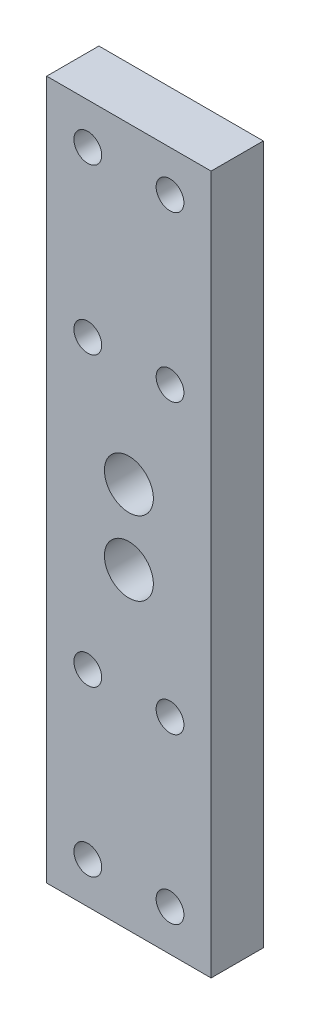
ISO-10303-21;
HEADER;
FILE_DESCRIPTION(('STEP AP214'),'2;1');
FILE_NAME('part.step','',(''),(''),'','','');
FILE_SCHEMA(('AUTOMOTIVE_DESIGN { 1 0 10303 214 1 1 1 1 }'));
ENDSEC;
DATA;
#1=APPLICATION_CONTEXT('core data for automotive mechanical design processes');
#2=APPLICATION_PROTOCOL_DEFINITION('international standard','automotive_design',2000,#1);
#3=PRODUCT_CONTEXT('',#1,'mechanical');
#4=PRODUCT('Part','Part','',(#3));
#5=PRODUCT_RELATED_PRODUCT_CATEGORY('part','',(#4));
#6=PRODUCT_DEFINITION_FORMATION('','',#4);
#7=PRODUCT_DEFINITION_CONTEXT('part definition',#1,'design');
#8=PRODUCT_DEFINITION('design','',#6,#7);
#9=PRODUCT_DEFINITION_SHAPE('','',#8);
#10=(LENGTH_UNIT() NAMED_UNIT(*) SI_UNIT(.MILLI.,.METRE.));
#11=(NAMED_UNIT(*) PLANE_ANGLE_UNIT() SI_UNIT($,.RADIAN.));
#12=(NAMED_UNIT(*) SI_UNIT($,.STERADIAN.) SOLID_ANGLE_UNIT());
#13=UNCERTAINTY_MEASURE_WITH_UNIT(LENGTH_MEASURE(1.E-05),#10,'distance_accuracy_value','');
#14=(GEOMETRIC_REPRESENTATION_CONTEXT(3) GLOBAL_UNCERTAINTY_ASSIGNED_CONTEXT((#13)) GLOBAL_UNIT_ASSIGNED_CONTEXT((#10,
#11,#12)) REPRESENTATION_CONTEXT('',''));
#15=CARTESIAN_POINT('',(0.,0.,0.));
#16=DIRECTION('',(0.,0.,1.));
#17=DIRECTION('',(1.,0.,0.));
#18=AXIS2_PLACEMENT_3D('',#15,#16,#17);
#19=CARTESIAN_POINT('',(-20.,85.,6.35));
#20=DIRECTION('',(1.,0.,0.));
#21=DIRECTION('',(0.,1.,0.));
#22=AXIS2_PLACEMENT_3D('',#19,#20,#21);
#23=PLANE('',#22);
#24=DIRECTION('',(0.,-1.,0.));
#25=VECTOR('',#24,1.);
#26=CARTESIAN_POINT('',(-20.,85.,-6.35));
#27=LINE('',#26,#25);
#28=CARTESIAN_POINT('',(-20.,85.,-6.35));
#29=VERTEX_POINT('',#28);
#30=CARTESIAN_POINT('',(-20.,-85.,-6.35));
#31=VERTEX_POINT('',#30);
#32=EDGE_CURVE('E96',#29,#31,#27,.T.);
#33=ORIENTED_EDGE('',*,*,#32,.T.);
#34=DIRECTION('',(0.,0.,-1.));
#35=VECTOR('',#34,1.);
#36=CARTESIAN_POINT('',(-20.,-85.,6.35));
#37=LINE('',#36,#35);
#38=CARTESIAN_POINT('',(-20.,-85.,6.35));
#39=VERTEX_POINT('',#38);
#40=EDGE_CURVE('E11',#39,#31,#37,.T.);
#41=ORIENTED_EDGE('',*,*,#40,.F.);
#42=DIRECTION('',(0.,-1.,0.));
#43=VECTOR('',#42,1.);
#44=CARTESIAN_POINT('',(-20.,85.,6.35));
#45=LINE('',#44,#43);
#46=CARTESIAN_POINT('',(-20.,85.,6.35));
#47=VERTEX_POINT('',#46);
#48=EDGE_CURVE('E84',#47,#39,#45,.T.);
#49=ORIENTED_EDGE('',*,*,#48,.F.);
#50=DIRECTION('',(0.,0.,-1.));
#51=VECTOR('',#50,1.);
#52=CARTESIAN_POINT('',(-20.,85.,6.35));
#53=LINE('',#52,#51);
#54=EDGE_CURVE('E92',#47,#29,#53,.T.);
#55=ORIENTED_EDGE('',*,*,#54,.T.);
#56=EDGE_LOOP('',(#33,#41,#49,#55));
#57=FACE_BOUND('',#56,.T.);
#58=ADVANCED_FACE('F33',(#57),#23,.F.);
#59=CARTESIAN_POINT('',(20.,-85.,6.35));
#60=DIRECTION('',(0.,1.,0.));
#61=DIRECTION('',(-1.,0.,0.));
#62=AXIS2_PLACEMENT_3D('',#59,#60,#61);
#63=PLANE('',#62);
#64=DIRECTION('',(1.,0.,0.));
#65=VECTOR('',#64,1.);
#66=CARTESIAN_POINT('',(20.,-85.,-6.35));
#67=LINE('',#66,#65);
#68=CARTESIAN_POINT('',(20.,-85.,-6.35));
#69=VERTEX_POINT('',#68);
#70=EDGE_CURVE('E88',#31,#69,#67,.T.);
#71=ORIENTED_EDGE('',*,*,#70,.T.);
#72=DIRECTION('',(0.,0.,-1.));
#73=VECTOR('',#72,1.);
#74=CARTESIAN_POINT('',(20.,-85.,6.35));
#75=LINE('',#74,#73);
#76=CARTESIAN_POINT('',(20.,-85.,6.35));
#77=VERTEX_POINT('',#76);
#78=EDGE_CURVE('E41',#77,#69,#75,.T.);
#79=ORIENTED_EDGE('',*,*,#78,.F.);
#80=DIRECTION('',(1.,0.,0.));
#81=VECTOR('',#80,1.);
#82=CARTESIAN_POINT('',(20.,-85.,6.35));
#83=LINE('',#82,#81);
#84=EDGE_CURVE('E79',#39,#77,#83,.T.);
#85=ORIENTED_EDGE('',*,*,#84,.F.);
#86=ORIENTED_EDGE('',*,*,#40,.T.);
#87=EDGE_LOOP('',(#71,#79,#85,#86));
#88=FACE_BOUND('',#87,.T.);
#89=ADVANCED_FACE('F87',(#88),#63,.F.);
#90=CARTESIAN_POINT('',(20.,85.,6.35));
#91=DIRECTION('',(-1.,0.,0.));
#92=DIRECTION('',(0.,-1.,0.));
#93=AXIS2_PLACEMENT_3D('',#90,#91,#92);
#94=PLANE('',#93);
#95=DIRECTION('',(0.,1.,0.));
#96=VECTOR('',#95,1.);
#97=CARTESIAN_POINT('',(20.,85.,-6.35));
#98=LINE('',#97,#96);
#99=CARTESIAN_POINT('',(20.,85.,-6.35));
#100=VERTEX_POINT('',#99);
#101=EDGE_CURVE('E66',#69,#100,#98,.T.);
#102=ORIENTED_EDGE('',*,*,#101,.T.);
#103=DIRECTION('',(0.,0.,-1.));
#104=VECTOR('',#103,1.);
#105=CARTESIAN_POINT('',(20.,85.,6.35));
#106=LINE('',#105,#104);
#107=CARTESIAN_POINT('',(20.,85.,6.35));
#108=VERTEX_POINT('',#107);
#109=EDGE_CURVE('E89',#108,#100,#106,.T.);
#110=ORIENTED_EDGE('',*,*,#109,.F.);
#111=DIRECTION('',(0.,1.,0.));
#112=VECTOR('',#111,1.);
#113=CARTESIAN_POINT('',(20.,85.,6.35));
#114=LINE('',#113,#112);
#115=EDGE_CURVE('E82',#77,#108,#114,.T.);
#116=ORIENTED_EDGE('',*,*,#115,.F.);
#117=ORIENTED_EDGE('',*,*,#78,.T.);
#118=EDGE_LOOP('',(#102,#110,#116,#117));
#119=FACE_BOUND('',#118,.T.);
#120=ADVANCED_FACE('F90',(#119),#94,.F.);
#121=CARTESIAN_POINT('',(20.,85.,6.35));
#122=DIRECTION('',(0.,-1.,0.));
#123=DIRECTION('',(1.,0.,0.));
#124=AXIS2_PLACEMENT_3D('',#121,#122,#123);
#125=PLANE('',#124);
#126=DIRECTION('',(-1.,0.,0.));
#127=VECTOR('',#126,1.);
#128=CARTESIAN_POINT('',(20.,85.,-6.35));
#129=LINE('',#128,#127);
#130=EDGE_CURVE('E72',#100,#29,#129,.T.);
#131=ORIENTED_EDGE('',*,*,#130,.T.);
#132=ORIENTED_EDGE('',*,*,#54,.F.);
#133=DIRECTION('',(-1.,0.,0.));
#134=VECTOR('',#133,1.);
#135=CARTESIAN_POINT('',(20.,85.,6.35));
#136=LINE('',#135,#134);
#137=EDGE_CURVE('E49',#108,#47,#136,.T.);
#138=ORIENTED_EDGE('',*,*,#137,.F.);
#139=ORIENTED_EDGE('',*,*,#109,.T.);
#140=EDGE_LOOP('',(#131,#132,#138,#139));
#141=FACE_BOUND('',#140,.T.);
#142=ADVANCED_FACE('F104',(#141),#125,.F.);
#143=CARTESIAN_POINT('',(0.,0.,6.35));
#144=DIRECTION('',(0.,0.,-1.));
#145=DIRECTION('',(-1.,0.,0.));
#146=AXIS2_PLACEMENT_3D('',#143,#144,#145);
#147=PLANE('',#146);
#148=CARTESIAN_POINT('',(1.51826910486956E-12,-8.99999999999994,6.35));
#149=DIRECTION('',(0.,0.,-1.));
#150=DIRECTION('',(-1.,0.,0.));
#151=AXIS2_PLACEMENT_3D('',#148,#149,#150);
#152=CIRCLE('',#151,5.95248999999999);
#153=CARTESIAN_POINT('',(-5.95248999999848,-8.99999999999994,6.35));
#154=VERTEX_POINT('',#153);
#155=EDGE_CURVE('E163',#154,#154,#152,.T.);
#156=ORIENTED_EDGE('',*,*,#155,.T.);
#157=EDGE_LOOP('',(#156));
#158=FACE_BOUND('',#157,.T.);
#159=CARTESIAN_POINT('',(1.52047347006448E-12,9.00000000000006,6.35));
#160=DIRECTION('',(0.,0.,-1.));
#161=DIRECTION('',(-1.,0.,0.));
#162=AXIS2_PLACEMENT_3D('',#159,#160,#161);
#163=CIRCLE('',#162,5.95248999999999);
#164=CARTESIAN_POINT('',(-5.95248999999847,9.00000000000006,6.35));
#165=VERTEX_POINT('',#164);
#166=EDGE_CURVE('E157',#165,#165,#163,.T.);
#167=ORIENTED_EDGE('',*,*,#166,.T.);
#168=EDGE_LOOP('',(#167));
#169=FACE_BOUND('',#168,.T.);
#170=CARTESIAN_POINT('',(9.99999999999999,75.,6.35));
#171=DIRECTION('',(0.,0.,1.));
#172=DIRECTION('',(1.,0.,0.));
#173=AXIS2_PLACEMENT_3D('',#170,#171,#172);
#174=CIRCLE('',#173,3.37819999999999);
#175=CARTESIAN_POINT('',(13.3782,75.,6.35));
#176=VERTEX_POINT('',#175);
#177=EDGE_CURVE('E154',#176,#176,#174,.T.);
#178=ORIENTED_EDGE('',*,*,#177,.F.);
#179=EDGE_LOOP('',(#178));
#180=FACE_BOUND('',#179,.T.);
#181=CARTESIAN_POINT('',(10.,35.,6.35));
#182=DIRECTION('',(0.,0.,1.));
#183=DIRECTION('',(1.,0.,0.));
#184=AXIS2_PLACEMENT_3D('',#181,#182,#183);
#185=CIRCLE('',#184,3.37819999999999);
#186=CARTESIAN_POINT('',(13.3782,35.,6.35));
#187=VERTEX_POINT('',#186);
#188=EDGE_CURVE('E148',#187,#187,#185,.T.);
#189=ORIENTED_EDGE('',*,*,#188,.F.);
#190=EDGE_LOOP('',(#189));
#191=FACE_BOUND('',#190,.T.);
#192=CARTESIAN_POINT('',(-10.,35.,6.35));
#193=DIRECTION('',(0.,0.,1.));
#194=DIRECTION('',(1.,0.,0.));
#195=AXIS2_PLACEMENT_3D('',#192,#193,#194);
#196=CIRCLE('',#195,3.37819999999999);
#197=CARTESIAN_POINT('',(-6.62180000000001,35.,6.35));
#198=VERTEX_POINT('',#197);
#199=EDGE_CURVE('E142',#198,#198,#196,.T.);
#200=ORIENTED_EDGE('',*,*,#199,.F.);
#201=EDGE_LOOP('',(#200));
#202=FACE_BOUND('',#201,.T.);
#203=CARTESIAN_POINT('',(-9.99999999999999,75.,6.35));
#204=DIRECTION('',(0.,0.,1.));
#205=DIRECTION('',(1.,0.,0.));
#206=AXIS2_PLACEMENT_3D('',#203,#204,#205);
#207=CIRCLE('',#206,3.37819999999999);
#208=CARTESIAN_POINT('',(-6.62180000000001,75.,6.35));
#209=VERTEX_POINT('',#208);
#210=EDGE_CURVE('E136',#209,#209,#207,.T.);
#211=ORIENTED_EDGE('',*,*,#210,.F.);
#212=EDGE_LOOP('',(#211));
#213=FACE_BOUND('',#212,.T.);
#214=CARTESIAN_POINT('',(-9.99999999999997,-75.,6.35));
#215=DIRECTION('',(0.,0.,1.));
#216=DIRECTION('',(1.,0.,0.));
#217=AXIS2_PLACEMENT_3D('',#214,#215,#216);
#218=CIRCLE('',#217,3.37819999999999);
#219=CARTESIAN_POINT('',(-6.62179999999999,-75.,6.35));
#220=VERTEX_POINT('',#219);
#221=EDGE_CURVE('E130',#220,#220,#218,.T.);
#222=ORIENTED_EDGE('',*,*,#221,.F.);
#223=EDGE_LOOP('',(#222));
#224=FACE_BOUND('',#223,.T.);
#225=CARTESIAN_POINT('',(-9.99999999999999,-35.,6.35));
#226=DIRECTION('',(0.,0.,1.));
#227=DIRECTION('',(1.,0.,0.));
#228=AXIS2_PLACEMENT_3D('',#225,#226,#227);
#229=CIRCLE('',#228,3.37819999999999);
#230=CARTESIAN_POINT('',(-6.6218,-35.,6.35));
#231=VERTEX_POINT('',#230);
#232=EDGE_CURVE('E124',#231,#231,#229,.T.);
#233=ORIENTED_EDGE('',*,*,#232,.F.);
#234=EDGE_LOOP('',(#233));
#235=FACE_BOUND('',#234,.T.);
#236=CARTESIAN_POINT('',(10.,-35.,6.35));
#237=DIRECTION('',(0.,0.,1.));
#238=DIRECTION('',(1.,0.,0.));
#239=AXIS2_PLACEMENT_3D('',#236,#237,#238);
#240=CIRCLE('',#239,3.37819999999999);
#241=CARTESIAN_POINT('',(13.3782,-35.,6.35));
#242=VERTEX_POINT('',#241);
#243=EDGE_CURVE('E118',#242,#242,#240,.T.);
#244=ORIENTED_EDGE('',*,*,#243,.F.);
#245=EDGE_LOOP('',(#244));
#246=FACE_BOUND('',#245,.T.);
#247=CARTESIAN_POINT('',(10.,-75.,6.35));
#248=DIRECTION('',(0.,0.,1.));
#249=DIRECTION('',(1.,0.,0.));
#250=AXIS2_PLACEMENT_3D('',#247,#248,#249);
#251=CIRCLE('',#250,3.37819999999999);
#252=CARTESIAN_POINT('',(13.3782,-75.,6.35));
#253=VERTEX_POINT('',#252);
#254=EDGE_CURVE('E112',#253,#253,#251,.T.);
#255=ORIENTED_EDGE('',*,*,#254,.F.);
#256=EDGE_LOOP('',(#255));
#257=FACE_BOUND('',#256,.T.);
#258=ORIENTED_EDGE('',*,*,#48,.T.);
#259=ORIENTED_EDGE('',*,*,#84,.T.);
#260=ORIENTED_EDGE('',*,*,#115,.T.);
#261=ORIENTED_EDGE('',*,*,#137,.T.);
#262=EDGE_LOOP('',(#258,#259,#260,#261));
#263=FACE_BOUND('',#262,.T.);
#264=ADVANCED_FACE('F80',(#158,#169,#180,#191,#202,#213,#224,#235,#246,#257,#263),#147,.F.);
#265=CARTESIAN_POINT('',(0.,0.,-6.35));
#266=DIRECTION('',(0.,0.,-1.));
#267=DIRECTION('',(-1.,0.,0.));
#268=AXIS2_PLACEMENT_3D('',#265,#266,#267);
#269=PLANE('',#268);
#270=CARTESIAN_POINT('',(1.51826910486956E-12,-8.99999999999994,-6.35));
#271=DIRECTION('',(0.,0.,-1.));
#272=DIRECTION('',(-1.,0.,0.));
#273=AXIS2_PLACEMENT_3D('',#270,#271,#272);
#274=CIRCLE('',#273,5.95248999999999);
#275=CARTESIAN_POINT('',(-5.95248999999847,-8.99999999999994,-6.35));
#276=VERTEX_POINT('',#275);
#277=EDGE_CURVE('E166',#276,#276,#274,.T.);
#278=ORIENTED_EDGE('',*,*,#277,.F.);
#279=EDGE_LOOP('',(#278));
#280=FACE_BOUND('',#279,.T.);
#281=CARTESIAN_POINT('',(1.52047347006448E-12,9.00000000000006,-6.35));
#282=DIRECTION('',(0.,0.,-1.));
#283=DIRECTION('',(-1.,0.,0.));
#284=AXIS2_PLACEMENT_3D('',#281,#282,#283);
#285=CIRCLE('',#284,5.95248999999999);
#286=CARTESIAN_POINT('',(-5.95248999999847,9.00000000000006,-6.35));
#287=VERTEX_POINT('',#286);
#288=EDGE_CURVE('E160',#287,#287,#285,.T.);
#289=ORIENTED_EDGE('',*,*,#288,.F.);
#290=EDGE_LOOP('',(#289));
#291=FACE_BOUND('',#290,.T.);
#292=CARTESIAN_POINT('',(9.99999999999999,75.,-6.35));
#293=DIRECTION('',(0.,0.,1.));
#294=DIRECTION('',(1.,0.,0.));
#295=AXIS2_PLACEMENT_3D('',#292,#293,#294);
#296=CIRCLE('',#295,3.3782);
#297=CARTESIAN_POINT('',(13.3782,75.,-6.35));
#298=VERTEX_POINT('',#297);
#299=EDGE_CURVE('E151',#298,#298,#296,.T.);
#300=ORIENTED_EDGE('',*,*,#299,.T.);
#301=EDGE_LOOP('',(#300));
#302=FACE_BOUND('',#301,.T.);
#303=CARTESIAN_POINT('',(10.,35.,-6.35));
#304=DIRECTION('',(0.,0.,1.));
#305=DIRECTION('',(1.,0.,0.));
#306=AXIS2_PLACEMENT_3D('',#303,#304,#305);
#307=CIRCLE('',#306,3.3782);
#308=CARTESIAN_POINT('',(13.3782,35.,-6.35));
#309=VERTEX_POINT('',#308);
#310=EDGE_CURVE('E145',#309,#309,#307,.T.);
#311=ORIENTED_EDGE('',*,*,#310,.T.);
#312=EDGE_LOOP('',(#311));
#313=FACE_BOUND('',#312,.T.);
#314=CARTESIAN_POINT('',(-10.,35.,-6.35));
#315=DIRECTION('',(0.,0.,1.));
#316=DIRECTION('',(1.,0.,0.));
#317=AXIS2_PLACEMENT_3D('',#314,#315,#316);
#318=CIRCLE('',#317,3.3782);
#319=CARTESIAN_POINT('',(-6.6218,35.,-6.35));
#320=VERTEX_POINT('',#319);
#321=EDGE_CURVE('E139',#320,#320,#318,.T.);
#322=ORIENTED_EDGE('',*,*,#321,.T.);
#323=EDGE_LOOP('',(#322));
#324=FACE_BOUND('',#323,.T.);
#325=CARTESIAN_POINT('',(-9.99999999999999,75.,-6.35));
#326=DIRECTION('',(0.,0.,1.));
#327=DIRECTION('',(1.,0.,0.));
#328=AXIS2_PLACEMENT_3D('',#325,#326,#327);
#329=CIRCLE('',#328,3.3782);
#330=CARTESIAN_POINT('',(-6.6218,75.,-6.35));
#331=VERTEX_POINT('',#330);
#332=EDGE_CURVE('E133',#331,#331,#329,.T.);
#333=ORIENTED_EDGE('',*,*,#332,.T.);
#334=EDGE_LOOP('',(#333));
#335=FACE_BOUND('',#334,.T.);
#336=CARTESIAN_POINT('',(-9.99999999999997,-75.,-6.35));
#337=DIRECTION('',(0.,0.,1.));
#338=DIRECTION('',(1.,0.,0.));
#339=AXIS2_PLACEMENT_3D('',#336,#337,#338);
#340=CIRCLE('',#339,3.3782);
#341=CARTESIAN_POINT('',(-6.62179999999998,-75.,-6.35));
#342=VERTEX_POINT('',#341);
#343=EDGE_CURVE('E127',#342,#342,#340,.T.);
#344=ORIENTED_EDGE('',*,*,#343,.T.);
#345=EDGE_LOOP('',(#344));
#346=FACE_BOUND('',#345,.T.);
#347=CARTESIAN_POINT('',(-9.99999999999999,-35.,-6.35));
#348=DIRECTION('',(0.,0.,1.));
#349=DIRECTION('',(1.,0.,0.));
#350=AXIS2_PLACEMENT_3D('',#347,#348,#349);
#351=CIRCLE('',#350,3.3782);
#352=CARTESIAN_POINT('',(-6.62179999999999,-35.,-6.35));
#353=VERTEX_POINT('',#352);
#354=EDGE_CURVE('E121',#353,#353,#351,.T.);
#355=ORIENTED_EDGE('',*,*,#354,.T.);
#356=EDGE_LOOP('',(#355));
#357=FACE_BOUND('',#356,.T.);
#358=CARTESIAN_POINT('',(10.,-35.,-6.35));
#359=DIRECTION('',(0.,0.,1.));
#360=DIRECTION('',(1.,0.,0.));
#361=AXIS2_PLACEMENT_3D('',#358,#359,#360);
#362=CIRCLE('',#361,3.3782);
#363=CARTESIAN_POINT('',(13.3782,-35.,-6.35));
#364=VERTEX_POINT('',#363);
#365=EDGE_CURVE('E115',#364,#364,#362,.T.);
#366=ORIENTED_EDGE('',*,*,#365,.T.);
#367=EDGE_LOOP('',(#366));
#368=FACE_BOUND('',#367,.T.);
#369=CARTESIAN_POINT('',(10.,-75.,-6.35));
#370=DIRECTION('',(0.,0.,1.));
#371=DIRECTION('',(1.,0.,0.));
#372=AXIS2_PLACEMENT_3D('',#369,#370,#371);
#373=CIRCLE('',#372,3.3782);
#374=CARTESIAN_POINT('',(13.3782,-75.,-6.35));
#375=VERTEX_POINT('',#374);
#376=EDGE_CURVE('E99',#375,#375,#373,.T.);
#377=ORIENTED_EDGE('',*,*,#376,.T.);
#378=EDGE_LOOP('',(#377));
#379=FACE_BOUND('',#378,.T.);
#380=ORIENTED_EDGE('',*,*,#32,.F.);
#381=ORIENTED_EDGE('',*,*,#130,.F.);
#382=ORIENTED_EDGE('',*,*,#101,.F.);
#383=ORIENTED_EDGE('',*,*,#70,.F.);
#384=EDGE_LOOP('',(#380,#381,#382,#383));
#385=FACE_BOUND('',#384,.T.);
#386=ADVANCED_FACE('F107',(#280,#291,#302,#313,#324,#335,#346,#357,#368,#379,#385),#269,.T.);
#387=CARTESIAN_POINT('',(10.,-75.,6.35));
#388=DIRECTION('',(0.,0.,1.));
#389=DIRECTION('',(1.,0.,0.));
#390=AXIS2_PLACEMENT_3D('',#387,#388,#389);
#391=CYLINDRICAL_SURFACE('',#390,3.37819999999999);
#392=ORIENTED_EDGE('',*,*,#376,.F.);
#393=EDGE_LOOP('',(#392));
#394=FACE_BOUND('',#393,.T.);
#395=ORIENTED_EDGE('',*,*,#254,.T.);
#396=EDGE_LOOP('',(#395));
#397=FACE_BOUND('',#396,.T.);
#398=ADVANCED_FACE('F174',(#394,#397),#391,.F.);
#399=CARTESIAN_POINT('',(10.,-35.,6.35));
#400=DIRECTION('',(0.,0.,1.));
#401=DIRECTION('',(1.,0.,0.));
#402=AXIS2_PLACEMENT_3D('',#399,#400,#401);
#403=CYLINDRICAL_SURFACE('',#402,3.37819999999999);
#404=ORIENTED_EDGE('',*,*,#365,.F.);
#405=EDGE_LOOP('',(#404));
#406=FACE_BOUND('',#405,.T.);
#407=ORIENTED_EDGE('',*,*,#243,.T.);
#408=EDGE_LOOP('',(#407));
#409=FACE_BOUND('',#408,.T.);
#410=ADVANCED_FACE('F196',(#406,#409),#403,.F.);
#411=CARTESIAN_POINT('',(-9.99999999999999,-35.,6.35));
#412=DIRECTION('',(0.,0.,1.));
#413=DIRECTION('',(1.,0.,0.));
#414=AXIS2_PLACEMENT_3D('',#411,#412,#413);
#415=CYLINDRICAL_SURFACE('',#414,3.37819999999999);
#416=ORIENTED_EDGE('',*,*,#354,.F.);
#417=EDGE_LOOP('',(#416));
#418=FACE_BOUND('',#417,.T.);
#419=ORIENTED_EDGE('',*,*,#232,.T.);
#420=EDGE_LOOP('',(#419));
#421=FACE_BOUND('',#420,.T.);
#422=ADVANCED_FACE('F244',(#418,#421),#415,.F.);
#423=CARTESIAN_POINT('',(-9.99999999999997,-75.,6.35));
#424=DIRECTION('',(0.,0.,1.));
#425=DIRECTION('',(1.,0.,0.));
#426=AXIS2_PLACEMENT_3D('',#423,#424,#425);
#427=CYLINDRICAL_SURFACE('',#426,3.37819999999999);
#428=ORIENTED_EDGE('',*,*,#343,.F.);
#429=EDGE_LOOP('',(#428));
#430=FACE_BOUND('',#429,.T.);
#431=ORIENTED_EDGE('',*,*,#221,.T.);
#432=EDGE_LOOP('',(#431));
#433=FACE_BOUND('',#432,.T.);
#434=ADVANCED_FACE('F252',(#430,#433),#427,.F.);
#435=CARTESIAN_POINT('',(-9.99999999999999,75.,6.35));
#436=DIRECTION('',(0.,0.,1.));
#437=DIRECTION('',(1.,0.,0.));
#438=AXIS2_PLACEMENT_3D('',#435,#436,#437);
#439=CYLINDRICAL_SURFACE('',#438,3.37819999999999);
#440=ORIENTED_EDGE('',*,*,#332,.F.);
#441=EDGE_LOOP('',(#440));
#442=FACE_BOUND('',#441,.T.);
#443=ORIENTED_EDGE('',*,*,#210,.T.);
#444=EDGE_LOOP('',(#443));
#445=FACE_BOUND('',#444,.T.);
#446=ADVANCED_FACE('F260',(#442,#445),#439,.F.);
#447=CARTESIAN_POINT('',(-10.,35.,6.35));
#448=DIRECTION('',(0.,0.,1.));
#449=DIRECTION('',(1.,0.,0.));
#450=AXIS2_PLACEMENT_3D('',#447,#448,#449);
#451=CYLINDRICAL_SURFACE('',#450,3.37819999999999);
#452=ORIENTED_EDGE('',*,*,#321,.F.);
#453=EDGE_LOOP('',(#452));
#454=FACE_BOUND('',#453,.T.);
#455=ORIENTED_EDGE('',*,*,#199,.T.);
#456=EDGE_LOOP('',(#455));
#457=FACE_BOUND('',#456,.T.);
#458=ADVANCED_FACE('F268',(#454,#457),#451,.F.);
#459=CARTESIAN_POINT('',(10.,35.,6.35));
#460=DIRECTION('',(0.,0.,1.));
#461=DIRECTION('',(1.,0.,0.));
#462=AXIS2_PLACEMENT_3D('',#459,#460,#461);
#463=CYLINDRICAL_SURFACE('',#462,3.37819999999999);
#464=ORIENTED_EDGE('',*,*,#310,.F.);
#465=EDGE_LOOP('',(#464));
#466=FACE_BOUND('',#465,.T.);
#467=ORIENTED_EDGE('',*,*,#188,.T.);
#468=EDGE_LOOP('',(#467));
#469=FACE_BOUND('',#468,.T.);
#470=ADVANCED_FACE('F276',(#466,#469),#463,.F.);
#471=CARTESIAN_POINT('',(9.99999999999999,75.,6.35));
#472=DIRECTION('',(0.,0.,1.));
#473=DIRECTION('',(1.,0.,0.));
#474=AXIS2_PLACEMENT_3D('',#471,#472,#473);
#475=CYLINDRICAL_SURFACE('',#474,3.37819999999999);
#476=ORIENTED_EDGE('',*,*,#299,.F.);
#477=EDGE_LOOP('',(#476));
#478=FACE_BOUND('',#477,.T.);
#479=ORIENTED_EDGE('',*,*,#177,.T.);
#480=EDGE_LOOP('',(#479));
#481=FACE_BOUND('',#480,.T.);
#482=ADVANCED_FACE('F284',(#478,#481),#475,.F.);
#483=CARTESIAN_POINT('',(1.52047347006448E-12,9.00000000000006,-6.35));
#484=DIRECTION('',(0.,0.,-1.));
#485=DIRECTION('',(-1.,0.,0.));
#486=AXIS2_PLACEMENT_3D('',#483,#484,#485);
#487=CYLINDRICAL_SURFACE('',#486,5.95248999999999);
#488=ORIENTED_EDGE('',*,*,#166,.F.);
#489=EDGE_LOOP('',(#488));
#490=FACE_BOUND('',#489,.T.);
#491=ORIENTED_EDGE('',*,*,#288,.T.);
#492=EDGE_LOOP('',(#491));
#493=FACE_BOUND('',#492,.T.);
#494=ADVANCED_FACE('F291',(#490,#493),#487,.F.);
#495=CARTESIAN_POINT('',(1.51826910486956E-12,-8.99999999999994,-6.35));
#496=DIRECTION('',(0.,0.,-1.));
#497=DIRECTION('',(-1.,0.,0.));
#498=AXIS2_PLACEMENT_3D('',#495,#496,#497);
#499=CYLINDRICAL_SURFACE('',#498,5.95248999999999);
#500=ORIENTED_EDGE('',*,*,#155,.F.);
#501=EDGE_LOOP('',(#500));
#502=FACE_BOUND('',#501,.T.);
#503=ORIENTED_EDGE('',*,*,#277,.T.);
#504=EDGE_LOOP('',(#503));
#505=FACE_BOUND('',#504,.T.);
#506=ADVANCED_FACE('F170',(#502,#505),#499,.F.);
#507=CLOSED_SHELL('',(#58,#89,#120,#142,#264,#386,#398,#410,#422,#434,#446,#458,#470,#482,#494,#506));
#508=MANIFOLD_SOLID_BREP('B2',#507);
#509=ADVANCED_BREP_SHAPE_REPRESENTATION('',(#18,#508),#14);
#510=SHAPE_DEFINITION_REPRESENTATION(#9,#509);
ENDSEC;
END-ISO-10303-21;
